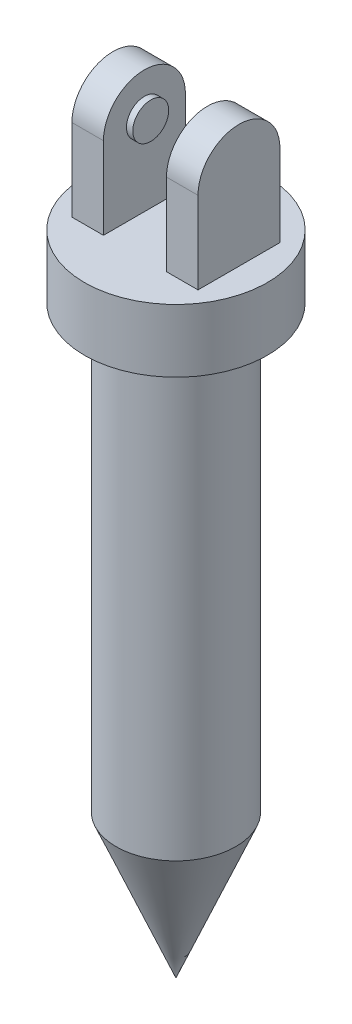
ISO-10303-21;
HEADER;
FILE_DESCRIPTION(('STEP AP214'),'2;1');
FILE_NAME('part.step','',(''),(''),'','','');
FILE_SCHEMA(('AUTOMOTIVE_DESIGN { 1 0 10303 214 1 1 1 1 }'));
ENDSEC;
DATA;
#1=APPLICATION_CONTEXT('core data for automotive mechanical design processes');
#2=APPLICATION_PROTOCOL_DEFINITION('international standard','automotive_design',2000,#1);
#3=PRODUCT_CONTEXT('',#1,'mechanical');
#4=PRODUCT('Part','Part','',(#3));
#5=PRODUCT_RELATED_PRODUCT_CATEGORY('part','',(#4));
#6=PRODUCT_DEFINITION_FORMATION('','',#4);
#7=PRODUCT_DEFINITION_CONTEXT('part definition',#1,'design');
#8=PRODUCT_DEFINITION('design','',#6,#7);
#9=PRODUCT_DEFINITION_SHAPE('','',#8);
#10=(LENGTH_UNIT() NAMED_UNIT(*) SI_UNIT(.MILLI.,.METRE.));
#11=(NAMED_UNIT(*) PLANE_ANGLE_UNIT() SI_UNIT($,.RADIAN.));
#12=(NAMED_UNIT(*) SI_UNIT($,.STERADIAN.) SOLID_ANGLE_UNIT());
#13=UNCERTAINTY_MEASURE_WITH_UNIT(LENGTH_MEASURE(1.E-05),#10,'distance_accuracy_value','');
#14=(GEOMETRIC_REPRESENTATION_CONTEXT(3) GLOBAL_UNCERTAINTY_ASSIGNED_CONTEXT((#13)) GLOBAL_UNIT_ASSIGNED_CONTEXT((#10,
#11,#12)) REPRESENTATION_CONTEXT('',''));
#15=CARTESIAN_POINT('',(0.,0.,0.));
#16=DIRECTION('',(0.,0.,1.));
#17=DIRECTION('',(1.,0.,0.));
#18=AXIS2_PLACEMENT_3D('',#15,#16,#17);
#19=CARTESIAN_POINT('',(5.,11.5,0.));
#20=DIRECTION('',(-1.,0.,0.));
#21=DIRECTION('',(0.,0.,1.));
#22=AXIS2_PLACEMENT_3D('',#19,#20,#21);
#23=CYLINDRICAL_SURFACE('',#22,3.25);
#24=DIRECTION('',(-1.,0.,0.));
#25=VECTOR('',#24,1.);
#26=CARTESIAN_POINT('',(5.,11.5,3.25));
#27=LINE('',#26,#25);
#28=CARTESIAN_POINT('',(-2.5,11.5,3.25));
#29=VERTEX_POINT('',#28);
#30=CARTESIAN_POINT('',(-5.,11.5,3.25));
#31=VERTEX_POINT('',#30);
#32=EDGE_CURVE('E67',#29,#31,#27,.T.);
#33=ORIENTED_EDGE('',*,*,#32,.F.);
#34=CARTESIAN_POINT('',(-2.5,11.5,0.));
#35=DIRECTION('',(-1.,0.,0.));
#36=DIRECTION('',(0.,-1.,0.));
#37=AXIS2_PLACEMENT_3D('',#34,#35,#36);
#38=CIRCLE('',#37,3.25);
#39=CARTESIAN_POINT('',(-2.5,11.5,-3.25));
#40=VERTEX_POINT('',#39);
#41=EDGE_CURVE('E201',#29,#40,#38,.T.);
#42=ORIENTED_EDGE('',*,*,#41,.T.);
#43=DIRECTION('',(-1.,0.,0.));
#44=VECTOR('',#43,1.);
#45=CARTESIAN_POINT('',(5.,11.5,-3.25));
#46=LINE('',#45,#44);
#47=CARTESIAN_POINT('',(-5.,11.5,-3.25));
#48=VERTEX_POINT('',#47);
#49=EDGE_CURVE('E161',#40,#48,#46,.T.);
#50=ORIENTED_EDGE('',*,*,#49,.T.);
#51=CARTESIAN_POINT('',(-5.,11.5,0.));
#52=DIRECTION('',(1.,0.,0.));
#53=DIRECTION('',(0.,0.,1.));
#54=AXIS2_PLACEMENT_3D('',#51,#52,#53);
#55=CIRCLE('',#54,3.25);
#56=EDGE_CURVE('E210',#48,#31,#55,.T.);
#57=ORIENTED_EDGE('',*,*,#56,.T.);
#58=EDGE_LOOP('',(#33,#42,#50,#57));
#59=FACE_BOUND('',#58,.T.);
#60=ADVANCED_FACE('F43',(#59),#23,.T.);
#61=CARTESIAN_POINT('',(5.,11.5,-3.25));
#62=DIRECTION('',(0.,0.,1.));
#63=DIRECTION('',(0.,-1.,0.));
#64=AXIS2_PLACEMENT_3D('',#61,#62,#63);
#65=PLANE('',#64);
#66=ORIENTED_EDGE('',*,*,#49,.F.);
#67=DIRECTION('',(0.,-1.,0.));
#68=VECTOR('',#67,1.);
#69=CARTESIAN_POINT('',(-2.5,11.5,-3.25));
#70=LINE('',#69,#68);
#71=CARTESIAN_POINT('',(-2.5,5.,-3.25));
#72=VERTEX_POINT('',#71);
#73=EDGE_CURVE('E221',#40,#72,#70,.T.);
#74=ORIENTED_EDGE('',*,*,#73,.T.);
#75=DIRECTION('',(-1.,0.,0.));
#76=VECTOR('',#75,1.);
#77=CARTESIAN_POINT('',(5.,5.,-3.25));
#78=LINE('',#77,#76);
#79=CARTESIAN_POINT('',(-5.,5.,-3.25));
#80=VERTEX_POINT('',#79);
#81=EDGE_CURVE('E173',#72,#80,#78,.T.);
#82=ORIENTED_EDGE('',*,*,#81,.T.);
#83=DIRECTION('',(0.,1.,0.));
#84=VECTOR('',#83,1.);
#85=CARTESIAN_POINT('',(-5.,11.5,-3.25));
#86=LINE('',#85,#84);
#87=EDGE_CURVE('E169',#80,#48,#86,.T.);
#88=ORIENTED_EDGE('',*,*,#87,.T.);
#89=EDGE_LOOP('',(#66,#74,#82,#88));
#90=FACE_BOUND('',#89,.T.);
#91=ADVANCED_FACE('F125',(#90),#65,.F.);
#92=CARTESIAN_POINT('',(5.,11.5,3.25));
#93=DIRECTION('',(0.,0.,-1.));
#94=DIRECTION('',(0.,1.,0.));
#95=AXIS2_PLACEMENT_3D('',#92,#93,#94);
#96=PLANE('',#95);
#97=DIRECTION('',(-1.,0.,0.));
#98=VECTOR('',#97,1.);
#99=CARTESIAN_POINT('',(5.,5.,3.25));
#100=LINE('',#99,#98);
#101=CARTESIAN_POINT('',(-2.5,5.,3.25));
#102=VERTEX_POINT('',#101);
#103=CARTESIAN_POINT('',(-5.,5.,3.25));
#104=VERTEX_POINT('',#103);
#105=EDGE_CURVE('E177',#102,#104,#100,.T.);
#106=ORIENTED_EDGE('',*,*,#105,.F.);
#107=DIRECTION('',(0.,1.,0.));
#108=VECTOR('',#107,1.);
#109=CARTESIAN_POINT('',(-2.5,11.5,3.25));
#110=LINE('',#109,#108);
#111=EDGE_CURVE('E186',#102,#29,#110,.T.);
#112=ORIENTED_EDGE('',*,*,#111,.T.);
#113=ORIENTED_EDGE('',*,*,#32,.T.);
#114=DIRECTION('',(0.,-1.,0.));
#115=VECTOR('',#114,1.);
#116=CARTESIAN_POINT('',(-5.,11.5,3.25));
#117=LINE('',#116,#115);
#118=EDGE_CURVE('E203',#31,#104,#117,.T.);
#119=ORIENTED_EDGE('',*,*,#118,.T.);
#120=EDGE_LOOP('',(#106,#112,#113,#119));
#121=FACE_BOUND('',#120,.T.);
#122=ADVANCED_FACE('F132',(#121),#96,.F.);
#123=CARTESIAN_POINT('',(0.,5.,0.));
#124=DIRECTION('',(0.,-1.,0.));
#125=DIRECTION('',(0.,0.,-1.));
#126=AXIS2_PLACEMENT_3D('',#123,#124,#125);
#127=CYLINDRICAL_SURFACE('',#126,7.25);
#128=CARTESIAN_POINT('',(0.,5.,0.));
#129=DIRECTION('',(0.,1.,0.));
#130=DIRECTION('',(0.,0.,1.));
#131=AXIS2_PLACEMENT_3D('',#128,#129,#130);
#132=CIRCLE('',#131,7.25);
#133=CARTESIAN_POINT('',(0.,5.,7.25));
#134=VERTEX_POINT('',#133);
#135=EDGE_CURVE('E183',#134,#134,#132,.T.);
#136=ORIENTED_EDGE('',*,*,#135,.F.);
#137=EDGE_LOOP('',(#136));
#138=FACE_BOUND('',#137,.T.);
#139=CARTESIAN_POINT('',(0.,0.,0.));
#140=DIRECTION('',(0.,1.,0.));
#141=DIRECTION('',(0.,0.,1.));
#142=AXIS2_PLACEMENT_3D('',#139,#140,#141);
#143=CIRCLE('',#142,7.25);
#144=CARTESIAN_POINT('',(0.,0.,7.25));
#145=VERTEX_POINT('',#144);
#146=EDGE_CURVE('E182',#145,#145,#143,.T.);
#147=ORIENTED_EDGE('',*,*,#146,.T.);
#148=EDGE_LOOP('',(#147));
#149=FACE_BOUND('',#148,.T.);
#150=ADVANCED_FACE('F45',(#138,#149),#127,.T.);
#151=CARTESIAN_POINT('',(0.,5.,0.));
#152=DIRECTION('',(0.,1.,0.));
#153=DIRECTION('',(0.,0.,1.));
#154=AXIS2_PLACEMENT_3D('',#151,#152,#153);
#155=PLANE('',#154);
#156=ORIENTED_EDGE('',*,*,#81,.F.);
#157=DIRECTION('',(0.,0.,1.));
#158=VECTOR('',#157,1.);
#159=CARTESIAN_POINT('',(-2.5,5.,-6.75));
#160=LINE('',#159,#158);
#161=EDGE_CURVE('E59',#72,#102,#160,.T.);
#162=ORIENTED_EDGE('',*,*,#161,.T.);
#163=ORIENTED_EDGE('',*,*,#105,.T.);
#164=DIRECTION('',(0.,0.,1.));
#165=VECTOR('',#164,1.);
#166=CARTESIAN_POINT('',(-5.,5.,0.));
#167=LINE('',#166,#165);
#168=EDGE_CURVE('E164',#80,#104,#167,.T.);
#169=ORIENTED_EDGE('',*,*,#168,.F.);
#170=EDGE_LOOP('',(#156,#162,#163,#169));
#171=FACE_BOUND('',#170,.T.);
#172=DIRECTION('',(0.,0.,1.));
#173=VECTOR('',#172,1.);
#174=CARTESIAN_POINT('',(2.5,5.,-6.75));
#175=LINE('',#174,#173);
#176=CARTESIAN_POINT('',(2.5,5.,-3.25));
#177=VERTEX_POINT('',#176);
#178=CARTESIAN_POINT('',(2.5,5.,3.25));
#179=VERTEX_POINT('',#178);
#180=EDGE_CURVE('E226',#177,#179,#175,.T.);
#181=ORIENTED_EDGE('',*,*,#180,.F.);
#182=CARTESIAN_POINT('',(5.,5.,-3.25));
#183=VERTEX_POINT('',#182);
#184=EDGE_CURVE('E166',#183,#177,#78,.T.);
#185=ORIENTED_EDGE('',*,*,#184,.F.);
#186=DIRECTION('',(0.,0.,-1.));
#187=VECTOR('',#186,1.);
#188=CARTESIAN_POINT('',(5.,5.,-5.));
#189=LINE('',#188,#187);
#190=CARTESIAN_POINT('',(5.,5.,3.25));
#191=VERTEX_POINT('',#190);
#192=EDGE_CURVE('E160',#191,#183,#189,.T.);
#193=ORIENTED_EDGE('',*,*,#192,.F.);
#194=EDGE_CURVE('E174',#191,#179,#100,.T.);
#195=ORIENTED_EDGE('',*,*,#194,.T.);
#196=EDGE_LOOP('',(#181,#185,#193,#195));
#197=FACE_BOUND('',#196,.T.);
#198=ORIENTED_EDGE('',*,*,#135,.T.);
#199=EDGE_LOOP('',(#198));
#200=FACE_BOUND('',#199,.T.);
#201=ADVANCED_FACE('F205',(#171,#197,#200),#155,.T.);
#202=CARTESIAN_POINT('',(0.,0.,0.));
#203=DIRECTION('',(0.,1.,0.));
#204=DIRECTION('',(0.,0.,1.));
#205=AXIS2_PLACEMENT_3D('',#202,#203,#204);
#206=PLANE('',#205);
#207=CARTESIAN_POINT('',(0.,0.,0.));
#208=DIRECTION('',(0.,-1.,0.));
#209=DIRECTION('',(0.,0.,-1.));
#210=AXIS2_PLACEMENT_3D('',#207,#208,#209);
#211=CIRCLE('',#210,4.75);
#212=CARTESIAN_POINT('',(0.,0.,-4.75));
#213=VERTEX_POINT('',#212);
#214=EDGE_CURVE('E11',#213,#213,#211,.T.);
#215=ORIENTED_EDGE('',*,*,#214,.F.);
#216=EDGE_LOOP('',(#215));
#217=FACE_BOUND('',#216,.T.);
#218=ORIENTED_EDGE('',*,*,#146,.F.);
#219=EDGE_LOOP('',(#218));
#220=FACE_BOUND('',#219,.T.);
#221=ADVANCED_FACE('F245',(#217,#220),#206,.F.);
#222=CARTESIAN_POINT('',(5.,15.,-5.));
#223=DIRECTION('',(-1.,0.,0.));
#224=DIRECTION('',(0.,0.,1.));
#225=AXIS2_PLACEMENT_3D('',#222,#223,#224);
#226=PLANE('',#225);
#227=ORIENTED_EDGE('',*,*,#192,.T.);
#228=DIRECTION('',(0.,1.,0.));
#229=VECTOR('',#228,1.);
#230=CARTESIAN_POINT('',(5.,11.5,-3.25));
#231=LINE('',#230,#229);
#232=CARTESIAN_POINT('',(5.,11.5,-3.25));
#233=VERTEX_POINT('',#232);
#234=EDGE_CURVE('E216',#183,#233,#231,.T.);
#235=ORIENTED_EDGE('',*,*,#234,.T.);
#236=CARTESIAN_POINT('',(5.,11.5,0.));
#237=DIRECTION('',(1.,0.,0.));
#238=DIRECTION('',(0.,0.,1.));
#239=AXIS2_PLACEMENT_3D('',#236,#237,#238);
#240=CIRCLE('',#239,3.25);
#241=CARTESIAN_POINT('',(5.,11.5,3.25));
#242=VERTEX_POINT('',#241);
#243=EDGE_CURVE('E156',#233,#242,#240,.T.);
#244=ORIENTED_EDGE('',*,*,#243,.T.);
#245=DIRECTION('',(0.,-1.,0.));
#246=VECTOR('',#245,1.);
#247=CARTESIAN_POINT('',(5.,11.5,3.25));
#248=LINE('',#247,#246);
#249=EDGE_CURVE('E212',#242,#191,#248,.T.);
#250=ORIENTED_EDGE('',*,*,#249,.T.);
#251=EDGE_LOOP('',(#227,#235,#244,#250));
#252=FACE_BOUND('',#251,.T.);
#253=ADVANCED_FACE('F147',(#252),#226,.F.);
#254=CARTESIAN_POINT('',(-5.,15.,0.));
#255=DIRECTION('',(1.,0.,0.));
#256=DIRECTION('',(0.,0.,-1.));
#257=AXIS2_PLACEMENT_3D('',#254,#255,#256);
#258=PLANE('',#257);
#259=ORIENTED_EDGE('',*,*,#56,.F.);
#260=ORIENTED_EDGE('',*,*,#87,.F.);
#261=ORIENTED_EDGE('',*,*,#168,.T.);
#262=ORIENTED_EDGE('',*,*,#118,.F.);
#263=EDGE_LOOP('',(#259,#260,#261,#262));
#264=FACE_BOUND('',#263,.T.);
#265=ADVANCED_FACE('F139',(#264),#258,.F.);
#266=CARTESIAN_POINT('',(2.5,11.5,-3.25));
#267=VERTEX_POINT('',#266);
#268=EDGE_CURVE('E152',#233,#267,#46,.T.);
#269=ORIENTED_EDGE('',*,*,#268,.T.);
#270=CARTESIAN_POINT('',(2.5,11.5,0.));
#271=DIRECTION('',(1.,0.,0.));
#272=DIRECTION('',(0.,1.,0.));
#273=AXIS2_PLACEMENT_3D('',#270,#271,#272);
#274=CIRCLE('',#273,3.25);
#275=CARTESIAN_POINT('',(2.5,11.5,3.25));
#276=VERTEX_POINT('',#275);
#277=EDGE_CURVE('E153',#267,#276,#274,.T.);
#278=ORIENTED_EDGE('',*,*,#277,.T.);
#279=EDGE_CURVE('E178',#242,#276,#27,.T.);
#280=ORIENTED_EDGE('',*,*,#279,.F.);
#281=ORIENTED_EDGE('',*,*,#243,.F.);
#282=EDGE_LOOP('',(#269,#278,#280,#281));
#283=FACE_BOUND('',#282,.T.);
#284=ADVANCED_FACE('F128',(#283),#23,.T.);
#285=ORIENTED_EDGE('',*,*,#184,.T.);
#286=DIRECTION('',(0.,1.,0.));
#287=VECTOR('',#286,1.);
#288=CARTESIAN_POINT('',(2.5,11.5,-3.25));
#289=LINE('',#288,#287);
#290=EDGE_CURVE('E224',#177,#267,#289,.T.);
#291=ORIENTED_EDGE('',*,*,#290,.T.);
#292=ORIENTED_EDGE('',*,*,#268,.F.);
#293=ORIENTED_EDGE('',*,*,#234,.F.);
#294=EDGE_LOOP('',(#285,#291,#292,#293));
#295=FACE_BOUND('',#294,.T.);
#296=ADVANCED_FACE('F135',(#295),#65,.F.);
#297=ORIENTED_EDGE('',*,*,#279,.T.);
#298=DIRECTION('',(0.,1.,0.));
#299=VECTOR('',#298,1.);
#300=CARTESIAN_POINT('',(2.5,5.,3.25));
#301=LINE('',#300,#299);
#302=EDGE_CURVE('E228',#179,#276,#301,.T.);
#303=ORIENTED_EDGE('',*,*,#302,.F.);
#304=ORIENTED_EDGE('',*,*,#194,.F.);
#305=ORIENTED_EDGE('',*,*,#249,.F.);
#306=EDGE_LOOP('',(#297,#303,#304,#305));
#307=FACE_BOUND('',#306,.T.);
#308=ADVANCED_FACE('F145',(#307),#96,.F.);
#309=CARTESIAN_POINT('',(-2.5,5.,-6.75));
#310=DIRECTION('',(-1.,0.,0.));
#311=DIRECTION('',(0.,-1.,0.));
#312=AXIS2_PLACEMENT_3D('',#309,#310,#311);
#313=PLANE('',#312);
#314=CARTESIAN_POINT('',(-2.5,11.5,0.));
#315=DIRECTION('',(-1.,0.,0.));
#316=DIRECTION('',(0.,-1.,0.));
#317=AXIS2_PLACEMENT_3D('',#314,#315,#316);
#318=CIRCLE('',#317,1.425);
#319=CARTESIAN_POINT('',(-2.5,10.075,0.));
#320=VERTEX_POINT('',#319);
#321=EDGE_CURVE('E47',#320,#320,#318,.F.);
#322=ORIENTED_EDGE('',*,*,#321,.F.);
#323=EDGE_LOOP('',(#322));
#324=FACE_BOUND('',#323,.T.);
#325=ORIENTED_EDGE('',*,*,#111,.F.);
#326=ORIENTED_EDGE('',*,*,#161,.F.);
#327=ORIENTED_EDGE('',*,*,#73,.F.);
#328=ORIENTED_EDGE('',*,*,#41,.F.);
#329=EDGE_LOOP('',(#325,#326,#327,#328));
#330=FACE_BOUND('',#329,.T.);
#331=ADVANCED_FACE('F194',(#324,#330),#313,.F.);
#332=CARTESIAN_POINT('',(2.5,5.,-6.75));
#333=DIRECTION('',(1.,0.,0.));
#334=DIRECTION('',(0.,1.,0.));
#335=AXIS2_PLACEMENT_3D('',#332,#333,#334);
#336=PLANE('',#335);
#337=CARTESIAN_POINT('',(2.5,11.5,0.));
#338=DIRECTION('',(1.,0.,0.));
#339=DIRECTION('',(0.,1.,0.));
#340=AXIS2_PLACEMENT_3D('',#337,#338,#339);
#341=CIRCLE('',#340,1.425);
#342=CARTESIAN_POINT('',(2.5,12.925,0.));
#343=VERTEX_POINT('',#342);
#344=EDGE_CURVE('E235',#343,#343,#341,.T.);
#345=ORIENTED_EDGE('',*,*,#344,.T.);
#346=EDGE_LOOP('',(#345));
#347=FACE_BOUND('',#346,.T.);
#348=ORIENTED_EDGE('',*,*,#290,.F.);
#349=ORIENTED_EDGE('',*,*,#180,.T.);
#350=ORIENTED_EDGE('',*,*,#302,.T.);
#351=ORIENTED_EDGE('',*,*,#277,.F.);
#352=EDGE_LOOP('',(#348,#349,#350,#351));
#353=FACE_BOUND('',#352,.T.);
#354=ADVANCED_FACE('F197',(#347,#353),#336,.F.);
#355=CARTESIAN_POINT('',(-2.,11.5,0.));
#356=DIRECTION('',(-1.,0.,0.));
#357=DIRECTION('',(0.,-1.,0.));
#358=AXIS2_PLACEMENT_3D('',#355,#356,#357);
#359=CYLINDRICAL_SURFACE('',#358,1.425);
#360=CARTESIAN_POINT('',(-2.,11.5,0.));
#361=DIRECTION('',(1.,0.,0.));
#362=DIRECTION('',(0.,1.,0.));
#363=AXIS2_PLACEMENT_3D('',#360,#361,#362);
#364=CIRCLE('',#363,1.425);
#365=CARTESIAN_POINT('',(-2.,12.925,0.));
#366=VERTEX_POINT('',#365);
#367=EDGE_CURVE('E231',#366,#366,#364,.T.);
#368=ORIENTED_EDGE('',*,*,#367,.F.);
#369=EDGE_LOOP('',(#368));
#370=FACE_BOUND('',#369,.T.);
#371=ORIENTED_EDGE('',*,*,#321,.T.);
#372=EDGE_LOOP('',(#371));
#373=FACE_BOUND('',#372,.T.);
#374=ADVANCED_FACE('F192',(#370,#373),#359,.T.);
#375=CARTESIAN_POINT('',(-2.,11.5,0.));
#376=DIRECTION('',(1.,0.,0.));
#377=DIRECTION('',(0.,1.,0.));
#378=AXIS2_PLACEMENT_3D('',#375,#376,#377);
#379=PLANE('',#378);
#380=ORIENTED_EDGE('',*,*,#367,.T.);
#381=EDGE_LOOP('',(#380));
#382=FACE_BOUND('',#381,.T.);
#383=ADVANCED_FACE('F277',(#382),#379,.T.);
#384=CARTESIAN_POINT('',(2.,11.5,0.));
#385=DIRECTION('',(1.,0.,0.));
#386=DIRECTION('',(0.,1.,0.));
#387=AXIS2_PLACEMENT_3D('',#384,#385,#386);
#388=CYLINDRICAL_SURFACE('',#387,1.425);
#389=CARTESIAN_POINT('',(2.,11.5,0.));
#390=DIRECTION('',(1.,0.,0.));
#391=DIRECTION('',(0.,1.,0.));
#392=AXIS2_PLACEMENT_3D('',#389,#390,#391);
#393=CIRCLE('',#392,1.425);
#394=CARTESIAN_POINT('',(2.,12.925,0.));
#395=VERTEX_POINT('',#394);
#396=EDGE_CURVE('E234',#395,#395,#393,.T.);
#397=ORIENTED_EDGE('',*,*,#396,.T.);
#398=EDGE_LOOP('',(#397));
#399=FACE_BOUND('',#398,.T.);
#400=ORIENTED_EDGE('',*,*,#344,.F.);
#401=EDGE_LOOP('',(#400));
#402=FACE_BOUND('',#401,.T.);
#403=ADVANCED_FACE('F283',(#399,#402),#388,.T.);
#404=CARTESIAN_POINT('',(2.,11.5,0.));
#405=DIRECTION('',(-1.,0.,0.));
#406=DIRECTION('',(0.,1.,0.));
#407=AXIS2_PLACEMENT_3D('',#404,#405,#406);
#408=PLANE('',#407);
#409=ORIENTED_EDGE('',*,*,#396,.F.);
#410=EDGE_LOOP('',(#409));
#411=FACE_BOUND('',#410,.T.);
#412=ADVANCED_FACE('F120',(#411),#408,.T.);
#413=CARTESIAN_POINT('',(0.,-35.,0.));
#414=DIRECTION('',(0.,1.,0.));
#415=DIRECTION('',(0.,0.,1.));
#416=AXIS2_PLACEMENT_3D('',#413,#414,#415);
#417=CYLINDRICAL_SURFACE('',#416,4.75);
#418=CARTESIAN_POINT('',(0.,-35.,0.));
#419=DIRECTION('',(0.,-1.,0.));
#420=DIRECTION('',(0.,0.,-1.));
#421=AXIS2_PLACEMENT_3D('',#418,#419,#420);
#422=CIRCLE('',#421,4.75);
#423=CARTESIAN_POINT('',(0.,-35.,-4.75));
#424=VERTEX_POINT('',#423);
#425=EDGE_CURVE('E238',#424,#424,#422,.T.);
#426=ORIENTED_EDGE('',*,*,#425,.F.);
#427=EDGE_LOOP('',(#426));
#428=FACE_BOUND('',#427,.T.);
#429=ORIENTED_EDGE('',*,*,#214,.T.);
#430=EDGE_LOOP('',(#429));
#431=FACE_BOUND('',#430,.T.);
#432=ADVANCED_FACE('F114',(#428,#431),#417,.T.);
#433=CARTESIAN_POINT('',(0.,-46.4,0.));
#434=DIRECTION('',(0.,1.,0.));
#435=DIRECTION('',(0.,0.,1.));
#436=AXIS2_PLACEMENT_3D('',#433,#434,#435);
#437=CONICAL_SURFACE('',#436,0.,0.394791119699761);
#438=ORIENTED_EDGE('',*,*,#425,.T.);
#439=EDGE_LOOP('',(#438));
#440=FACE_BOUND('',#439,.T.);
#441=CARTESIAN_POINT('',(0.,-46.4,0.));
#442=VERTEX_POINT('',#441);
#443=VERTEX_LOOP('',#442);
#444=FACE_BOUND('',#443,.T.);
#445=ADVANCED_FACE('F112',(#440,#444),#437,.T.);
#446=CLOSED_SHELL('',(#60,#91,#122,#150,#201,#221,#253,#265,#284,#296,#308,#331,#354,#374,#383,
#403,#412,#432,#445));
#447=MANIFOLD_SOLID_BREP('B2',#446);
#448=ADVANCED_BREP_SHAPE_REPRESENTATION('',(#18,#447),#14);
#449=SHAPE_DEFINITION_REPRESENTATION(#9,#448);
ENDSEC;
END-ISO-10303-21;
